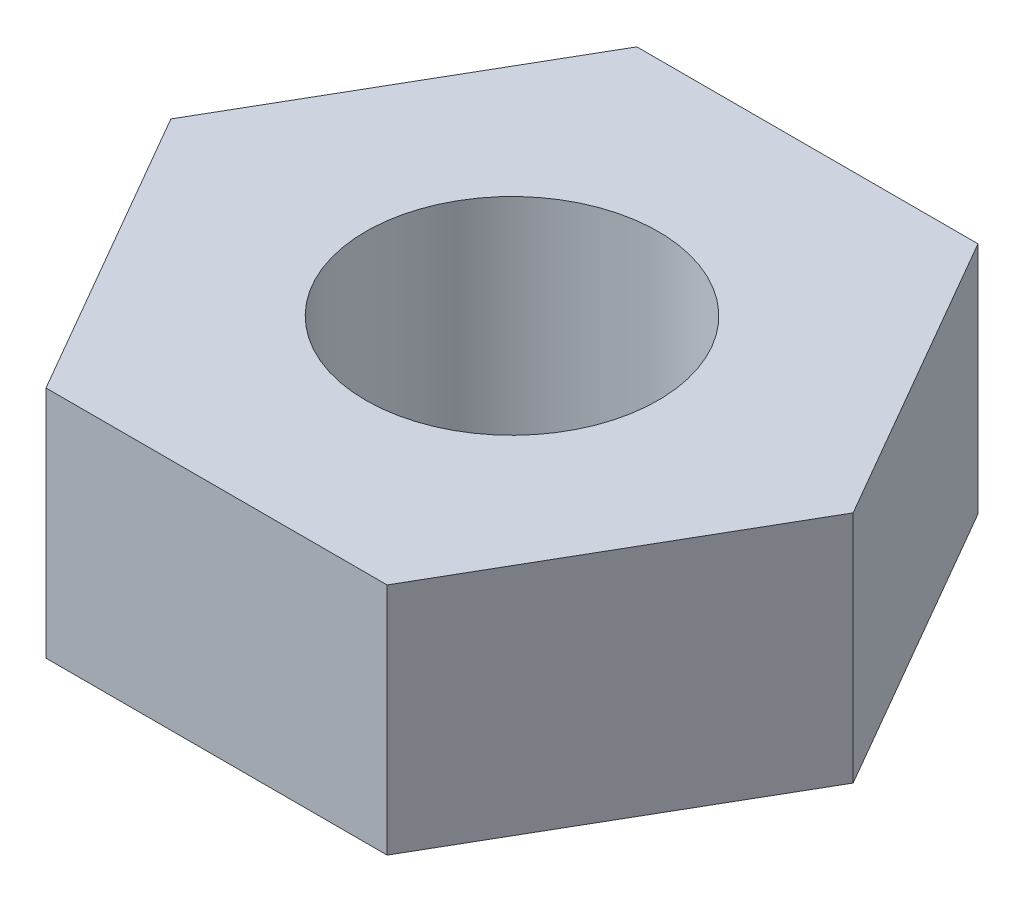
ISO-10303-21;
HEADER;
FILE_DESCRIPTION(('STEP AP214'),'2;1');
FILE_NAME('part.step','',(''),(''),'','','');
FILE_SCHEMA(('AUTOMOTIVE_DESIGN { 1 0 10303 214 1 1 1 1 }'));
ENDSEC;
DATA;
#1=APPLICATION_CONTEXT('core data for automotive mechanical design processes');
#2=APPLICATION_PROTOCOL_DEFINITION('international standard','automotive_design',2000,#1);
#3=PRODUCT_CONTEXT('',#1,'mechanical');
#4=PRODUCT('Part','Part','',(#3));
#5=PRODUCT_RELATED_PRODUCT_CATEGORY('part','',(#4));
#6=PRODUCT_DEFINITION_FORMATION('','',#4);
#7=PRODUCT_DEFINITION_CONTEXT('part definition',#1,'design');
#8=PRODUCT_DEFINITION('design','',#6,#7);
#9=PRODUCT_DEFINITION_SHAPE('','',#8);
#10=(LENGTH_UNIT() NAMED_UNIT(*) SI_UNIT(.MILLI.,.METRE.));
#11=(NAMED_UNIT(*) PLANE_ANGLE_UNIT() SI_UNIT($,.RADIAN.));
#12=(NAMED_UNIT(*) SI_UNIT($,.STERADIAN.) SOLID_ANGLE_UNIT());
#13=UNCERTAINTY_MEASURE_WITH_UNIT(LENGTH_MEASURE(1.E-05),#10,'distance_accuracy_value','');
#14=(GEOMETRIC_REPRESENTATION_CONTEXT(3) GLOBAL_UNCERTAINTY_ASSIGNED_CONTEXT((#13)) GLOBAL_UNIT_ASSIGNED_CONTEXT((#10,
#11,#12)) REPRESENTATION_CONTEXT('',''));
#15=CARTESIAN_POINT('',(0.,0.,0.));
#16=DIRECTION('',(0.,0.,1.));
#17=DIRECTION('',(1.,0.,0.));
#18=AXIS2_PLACEMENT_3D('',#15,#16,#17);
#19=CARTESIAN_POINT('',(0.,2.,0.));
#20=DIRECTION('',(0.,1.,0.));
#21=DIRECTION('',(0.,0.,1.));
#22=AXIS2_PLACEMENT_3D('',#19,#20,#21);
#23=PLANE('',#22);
#24=DIRECTION('',(0.499999999999995,0.,-0.866025403784441));
#25=VECTOR('',#24,1.);
#26=CARTESIAN_POINT('',(1.45780942970384,2.,2.52499999999998));
#27=LINE('',#26,#25);
#28=CARTESIAN_POINT('',(1.45780942970384,2.,2.52499999999998));
#29=VERTEX_POINT('',#28);
#30=CARTESIAN_POINT('',(2.91561885940761,2.,0.));
#31=VERTEX_POINT('',#30);
#32=EDGE_CURVE('E135',#29,#31,#27,.T.);
#33=ORIENTED_EDGE('',*,*,#32,.T.);
#34=DIRECTION('',(-0.500000000000001,0.,-0.866025403784438));
#35=VECTOR('',#34,1.);
#36=CARTESIAN_POINT('',(2.91561885940761,2.,0.));
#37=LINE('',#36,#35);
#38=CARTESIAN_POINT('',(1.4578094297038,2.,-2.525));
#39=VERTEX_POINT('',#38);
#40=EDGE_CURVE('E93',#31,#39,#37,.T.);
#41=ORIENTED_EDGE('',*,*,#40,.T.);
#42=DIRECTION('',(-1.,0.,0.));
#43=VECTOR('',#42,1.);
#44=CARTESIAN_POINT('',(1.4578094297038,2.,-2.525));
#45=LINE('',#44,#43);
#46=CARTESIAN_POINT('',(-1.45780942970382,2.,-2.525));
#47=VERTEX_POINT('',#46);
#48=EDGE_CURVE('E106',#39,#47,#45,.T.);
#49=ORIENTED_EDGE('',*,*,#48,.T.);
#50=DIRECTION('',(-0.499999999999995,0.,0.866025403784442));
#51=VECTOR('',#50,1.);
#52=CARTESIAN_POINT('',(-1.45780942970382,2.,-2.525));
#53=LINE('',#52,#51);
#54=CARTESIAN_POINT('',(-2.91561885940761,2.,0.));
#55=VERTEX_POINT('',#54);
#56=EDGE_CURVE('E100',#47,#55,#53,.T.);
#57=ORIENTED_EDGE('',*,*,#56,.T.);
#58=DIRECTION('',(0.500000000000007,0.,0.866025403784435));
#59=VECTOR('',#58,1.);
#60=CARTESIAN_POINT('',(-2.91561885940761,2.,0.));
#61=LINE('',#60,#59);
#62=CARTESIAN_POINT('',(-1.45780942970378,2.,2.52500000000002));
#63=VERTEX_POINT('',#62);
#64=EDGE_CURVE('E104',#55,#63,#61,.T.);
#65=ORIENTED_EDGE('',*,*,#64,.T.);
#66=DIRECTION('',(1.,0.,0.));
#67=VECTOR('',#66,1.);
#68=CARTESIAN_POINT('',(-1.45780942970378,2.,2.52500000000002));
#69=LINE('',#68,#67);
#70=EDGE_CURVE('E56',#63,#29,#69,.T.);
#71=ORIENTED_EDGE('',*,*,#70,.T.);
#72=EDGE_LOOP('',(#33,#41,#49,#57,#65,#71));
#73=FACE_BOUND('',#72,.T.);
#74=CARTESIAN_POINT('',(0.,2.,0.));
#75=DIRECTION('',(0.,1.,0.));
#76=DIRECTION('',(0.,0.,1.));
#77=AXIS2_PLACEMENT_3D('',#74,#75,#76);
#78=CIRCLE('',#77,1.25);
#79=CARTESIAN_POINT('',(0.,2.,1.25));
#80=VERTEX_POINT('',#79);
#81=EDGE_CURVE('E128',#80,#80,#78,.T.);
#82=ORIENTED_EDGE('',*,*,#81,.F.);
#83=EDGE_LOOP('',(#82));
#84=FACE_BOUND('',#83,.T.);
#85=ADVANCED_FACE('F39',(#73,#84),#23,.T.);
#86=CARTESIAN_POINT('',(0.,0.,0.));
#87=DIRECTION('',(0.,1.,0.));
#88=DIRECTION('',(0.,0.,1.));
#89=AXIS2_PLACEMENT_3D('',#86,#87,#88);
#90=PLANE('',#89);
#91=DIRECTION('',(0.499999999999995,0.,-0.866025403784441));
#92=VECTOR('',#91,1.);
#93=CARTESIAN_POINT('',(1.45780942970384,0.,2.52499999999998));
#94=LINE('',#93,#92);
#95=CARTESIAN_POINT('',(1.45780942970384,0.,2.52499999999998));
#96=VERTEX_POINT('',#95);
#97=CARTESIAN_POINT('',(2.91561885940761,0.,0.));
#98=VERTEX_POINT('',#97);
#99=EDGE_CURVE('E124',#96,#98,#94,.T.);
#100=ORIENTED_EDGE('',*,*,#99,.F.);
#101=DIRECTION('',(1.,0.,0.));
#102=VECTOR('',#101,1.);
#103=CARTESIAN_POINT('',(-1.45780942970378,0.,2.52500000000002));
#104=LINE('',#103,#102);
#105=CARTESIAN_POINT('',(-1.45780942970378,0.,2.52500000000002));
#106=VERTEX_POINT('',#105);
#107=EDGE_CURVE('E85',#106,#96,#104,.T.);
#108=ORIENTED_EDGE('',*,*,#107,.F.);
#109=DIRECTION('',(0.500000000000007,0.,0.866025403784435));
#110=VECTOR('',#109,1.);
#111=CARTESIAN_POINT('',(-2.91561885940761,0.,0.));
#112=LINE('',#111,#110);
#113=CARTESIAN_POINT('',(-2.91561885940761,0.,0.));
#114=VERTEX_POINT('',#113);
#115=EDGE_CURVE('E79',#114,#106,#112,.T.);
#116=ORIENTED_EDGE('',*,*,#115,.F.);
#117=DIRECTION('',(-0.499999999999995,0.,0.866025403784442));
#118=VECTOR('',#117,1.);
#119=CARTESIAN_POINT('',(-1.45780942970382,0.,-2.525));
#120=LINE('',#119,#118);
#121=CARTESIAN_POINT('',(-1.45780942970382,0.,-2.525));
#122=VERTEX_POINT('',#121);
#123=EDGE_CURVE('E114',#122,#114,#120,.T.);
#124=ORIENTED_EDGE('',*,*,#123,.F.);
#125=DIRECTION('',(-1.,0.,0.));
#126=VECTOR('',#125,1.);
#127=CARTESIAN_POINT('',(1.4578094297038,0.,-2.525));
#128=LINE('',#127,#126);
#129=CARTESIAN_POINT('',(1.4578094297038,0.,-2.525));
#130=VERTEX_POINT('',#129);
#131=EDGE_CURVE('E130',#130,#122,#128,.T.);
#132=ORIENTED_EDGE('',*,*,#131,.F.);
#133=DIRECTION('',(-0.500000000000001,0.,-0.866025403784438));
#134=VECTOR('',#133,1.);
#135=CARTESIAN_POINT('',(2.91561885940761,0.,0.));
#136=LINE('',#135,#134);
#137=EDGE_CURVE('E127',#98,#130,#136,.T.);
#138=ORIENTED_EDGE('',*,*,#137,.F.);
#139=EDGE_LOOP('',(#100,#108,#116,#124,#132,#138));
#140=FACE_BOUND('',#139,.T.);
#141=CARTESIAN_POINT('',(0.,0.,0.));
#142=DIRECTION('',(0.,1.,0.));
#143=DIRECTION('',(0.,0.,1.));
#144=AXIS2_PLACEMENT_3D('',#141,#142,#143);
#145=CIRCLE('',#144,1.25);
#146=CARTESIAN_POINT('',(0.,0.,1.25));
#147=VERTEX_POINT('',#146);
#148=EDGE_CURVE('E228',#147,#147,#145,.T.);
#149=ORIENTED_EDGE('',*,*,#148,.T.);
#150=EDGE_LOOP('',(#149));
#151=FACE_BOUND('',#150,.T.);
#152=ADVANCED_FACE('F144',(#140,#151),#90,.F.);
#153=CARTESIAN_POINT('',(1.45780942970384,2.,2.52499999999998));
#154=DIRECTION('',(-0.866025403784442,0.,-0.499999999999995));
#155=DIRECTION('',(-0.499999999999995,0.,0.866025403784442));
#156=AXIS2_PLACEMENT_3D('',#153,#154,#155);
#157=PLANE('',#156);
#158=ORIENTED_EDGE('',*,*,#99,.T.);
#159=DIRECTION('',(0.,-1.,0.));
#160=VECTOR('',#159,1.);
#161=CARTESIAN_POINT('',(2.91561885940761,2.,0.));
#162=LINE('',#161,#160);
#163=EDGE_CURVE('E11',#31,#98,#162,.T.);
#164=ORIENTED_EDGE('',*,*,#163,.F.);
#165=ORIENTED_EDGE('',*,*,#32,.F.);
#166=DIRECTION('',(0.,-1.,0.));
#167=VECTOR('',#166,1.);
#168=CARTESIAN_POINT('',(1.45780942970384,2.,2.52499999999998));
#169=LINE('',#168,#167);
#170=EDGE_CURVE('E120',#29,#96,#169,.T.);
#171=ORIENTED_EDGE('',*,*,#170,.T.);
#172=EDGE_LOOP('',(#158,#164,#165,#171));
#173=FACE_BOUND('',#172,.T.);
#174=ADVANCED_FACE('F41',(#173),#157,.F.);
#175=CARTESIAN_POINT('',(2.91561885940761,2.,0.));
#176=DIRECTION('',(-0.866025403784438,0.,0.500000000000001));
#177=DIRECTION('',(0.500000000000001,0.,0.866025403784438));
#178=AXIS2_PLACEMENT_3D('',#175,#176,#177);
#179=PLANE('',#178);
#180=ORIENTED_EDGE('',*,*,#137,.T.);
#181=DIRECTION('',(0.,-1.,0.));
#182=VECTOR('',#181,1.);
#183=CARTESIAN_POINT('',(1.4578094297038,2.,-2.525));
#184=LINE('',#183,#182);
#185=EDGE_CURVE('E48',#39,#130,#184,.T.);
#186=ORIENTED_EDGE('',*,*,#185,.F.);
#187=ORIENTED_EDGE('',*,*,#40,.F.);
#188=ORIENTED_EDGE('',*,*,#163,.T.);
#189=EDGE_LOOP('',(#180,#186,#187,#188));
#190=FACE_BOUND('',#189,.T.);
#191=ADVANCED_FACE('F169',(#190),#179,.F.);
#192=CARTESIAN_POINT('',(1.4578094297038,2.,-2.525));
#193=DIRECTION('',(0.,0.,1.));
#194=DIRECTION('',(1.,0.,0.));
#195=AXIS2_PLACEMENT_3D('',#192,#193,#194);
#196=PLANE('',#195);
#197=ORIENTED_EDGE('',*,*,#131,.T.);
#198=DIRECTION('',(0.,-1.,0.));
#199=VECTOR('',#198,1.);
#200=CARTESIAN_POINT('',(-1.45780942970382,2.,-2.525));
#201=LINE('',#200,#199);
#202=EDGE_CURVE('E115',#47,#122,#201,.T.);
#203=ORIENTED_EDGE('',*,*,#202,.F.);
#204=ORIENTED_EDGE('',*,*,#48,.F.);
#205=ORIENTED_EDGE('',*,*,#185,.T.);
#206=EDGE_LOOP('',(#197,#203,#204,#205));
#207=FACE_BOUND('',#206,.T.);
#208=ADVANCED_FACE('F141',(#207),#196,.F.);
#209=CARTESIAN_POINT('',(-1.45780942970382,2.,-2.525));
#210=DIRECTION('',(0.866025403784442,0.,0.499999999999995));
#211=DIRECTION('',(0.499999999999995,0.,-0.866025403784442));
#212=AXIS2_PLACEMENT_3D('',#209,#210,#211);
#213=PLANE('',#212);
#214=ORIENTED_EDGE('',*,*,#123,.T.);
#215=DIRECTION('',(0.,-1.,0.));
#216=VECTOR('',#215,1.);
#217=CARTESIAN_POINT('',(-2.91561885940761,2.,0.));
#218=LINE('',#217,#216);
#219=EDGE_CURVE('E111',#55,#114,#218,.T.);
#220=ORIENTED_EDGE('',*,*,#219,.F.);
#221=ORIENTED_EDGE('',*,*,#56,.F.);
#222=ORIENTED_EDGE('',*,*,#202,.T.);
#223=EDGE_LOOP('',(#214,#220,#221,#222));
#224=FACE_BOUND('',#223,.T.);
#225=ADVANCED_FACE('F112',(#224),#213,.F.);
#226=CARTESIAN_POINT('',(-2.91561885940761,2.,0.));
#227=DIRECTION('',(0.866025403784435,0.,-0.500000000000007));
#228=DIRECTION('',(-0.500000000000007,0.,-0.866025403784434));
#229=AXIS2_PLACEMENT_3D('',#226,#227,#228);
#230=PLANE('',#229);
#231=ORIENTED_EDGE('',*,*,#115,.T.);
#232=DIRECTION('',(0.,-1.,0.));
#233=VECTOR('',#232,1.);
#234=CARTESIAN_POINT('',(-1.45780942970378,2.,2.52500000000002));
#235=LINE('',#234,#233);
#236=EDGE_CURVE('E116',#63,#106,#235,.T.);
#237=ORIENTED_EDGE('',*,*,#236,.F.);
#238=ORIENTED_EDGE('',*,*,#64,.F.);
#239=ORIENTED_EDGE('',*,*,#219,.T.);
#240=EDGE_LOOP('',(#231,#237,#238,#239));
#241=FACE_BOUND('',#240,.T.);
#242=ADVANCED_FACE('F118',(#241),#230,.F.);
#243=CARTESIAN_POINT('',(-1.45780942970378,2.,2.52500000000002));
#244=DIRECTION('',(0.,0.,-1.));
#245=DIRECTION('',(-1.,0.,0.));
#246=AXIS2_PLACEMENT_3D('',#243,#244,#245);
#247=PLANE('',#246);
#248=ORIENTED_EDGE('',*,*,#107,.T.);
#249=ORIENTED_EDGE('',*,*,#170,.F.);
#250=ORIENTED_EDGE('',*,*,#70,.F.);
#251=ORIENTED_EDGE('',*,*,#236,.T.);
#252=EDGE_LOOP('',(#248,#249,#250,#251));
#253=FACE_BOUND('',#252,.T.);
#254=ADVANCED_FACE('F149',(#253),#247,.F.);
#255=CARTESIAN_POINT('',(0.,2.,0.));
#256=DIRECTION('',(0.,-1.,0.));
#257=DIRECTION('',(0.,0.,-1.));
#258=AXIS2_PLACEMENT_3D('',#255,#256,#257);
#259=CYLINDRICAL_SURFACE('',#258,1.25);
#260=ORIENTED_EDGE('',*,*,#81,.T.);
#261=EDGE_LOOP('',(#260));
#262=FACE_BOUND('',#261,.T.);
#263=ORIENTED_EDGE('',*,*,#148,.F.);
#264=EDGE_LOOP('',(#263));
#265=FACE_BOUND('',#264,.T.);
#266=ADVANCED_FACE('F151',(#262,#265),#259,.F.);
#267=CLOSED_SHELL('',(#85,#152,#174,#191,#208,#225,#242,#254,#266));
#268=MANIFOLD_SOLID_BREP('B2',#267);
#269=ADVANCED_BREP_SHAPE_REPRESENTATION('',(#18,#268),#14);
#270=SHAPE_DEFINITION_REPRESENTATION(#9,#269);
ENDSEC;
END-ISO-10303-21;
